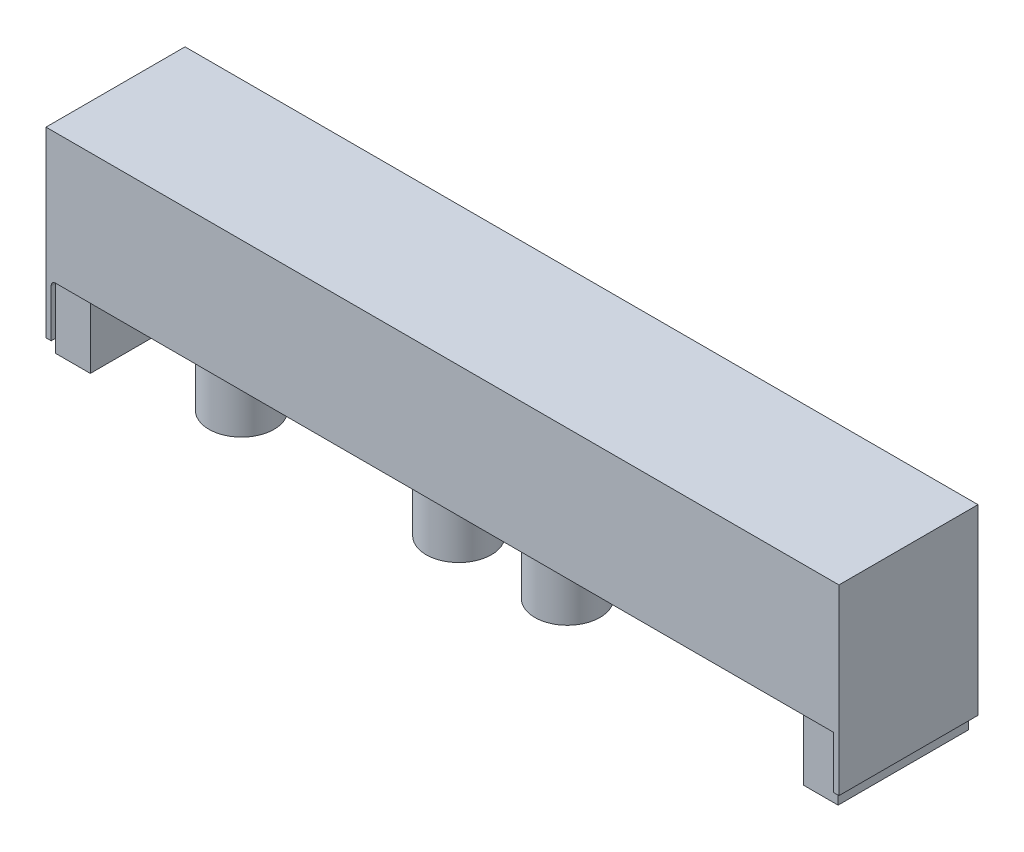
ISO-10303-21;
HEADER;
FILE_DESCRIPTION(('STEP AP214'),'2;1');
FILE_NAME('part.step','',(''),(''),'','','');
FILE_SCHEMA(('AUTOMOTIVE_DESIGN { 1 0 10303 214 1 1 1 1 }'));
ENDSEC;
DATA;
#1=APPLICATION_CONTEXT('core data for automotive mechanical design processes');
#2=APPLICATION_PROTOCOL_DEFINITION('international standard','automotive_design',2000,#1);
#3=PRODUCT_CONTEXT('',#1,'mechanical');
#4=PRODUCT('Part','Part','',(#3));
#5=PRODUCT_RELATED_PRODUCT_CATEGORY('part','',(#4));
#6=PRODUCT_DEFINITION_FORMATION('','',#4);
#7=PRODUCT_DEFINITION_CONTEXT('part definition',#1,'design');
#8=PRODUCT_DEFINITION('design','',#6,#7);
#9=PRODUCT_DEFINITION_SHAPE('','',#8);
#10=(LENGTH_UNIT() NAMED_UNIT(*) SI_UNIT(.MILLI.,.METRE.));
#11=(NAMED_UNIT(*) PLANE_ANGLE_UNIT() SI_UNIT($,.RADIAN.));
#12=(NAMED_UNIT(*) SI_UNIT($,.STERADIAN.) SOLID_ANGLE_UNIT());
#13=UNCERTAINTY_MEASURE_WITH_UNIT(LENGTH_MEASURE(1.E-05),#10,'distance_accuracy_value','');
#14=(GEOMETRIC_REPRESENTATION_CONTEXT(3) GLOBAL_UNCERTAINTY_ASSIGNED_CONTEXT((#13)) GLOBAL_UNIT_ASSIGNED_CONTEXT((#10,
#11,#12)) REPRESENTATION_CONTEXT('',''));
#15=CARTESIAN_POINT('',(0.,0.,0.));
#16=DIRECTION('',(0.,0.,1.));
#17=DIRECTION('',(1.,0.,0.));
#18=AXIS2_PLACEMENT_3D('',#15,#16,#17);
#19=CARTESIAN_POINT('',(86.05,1.4999999993961,11.));
#20=DIRECTION('',(0.,-1.,0.));
#21=DIRECTION('',(0.,0.,-1.));
#22=AXIS2_PLACEMENT_3D('',#19,#20,#21);
#23=CONICAL_SURFACE('',#22,1.22949999951077,1.02974425744243);
#24=CARTESIAN_POINT('',(86.0499999998865,2.23875813219365,11.));
#25=VERTEX_POINT('',#24);
#26=VERTEX_LOOP('',#25);
#27=FACE_BOUND('',#26,.T.);
#28=CARTESIAN_POINT('',(86.05,1.5,11.));
#29=DIRECTION('',(0.,-1.,0.));
#30=DIRECTION('',(0.,0.,-1.));
#31=AXIS2_PLACEMENT_3D('',#28,#29,#30);
#32=CIRCLE('',#31,1.2295);
#33=CARTESIAN_POINT('',(86.05,1.5,9.7705));
#34=VERTEX_POINT('',#33);
#35=EDGE_CURVE('E389',#34,#34,#32,.T.);
#36=ORIENTED_EDGE('',*,*,#35,.T.);
#37=EDGE_LOOP('',(#36));
#38=FACE_BOUND('',#37,.T.);
#39=ADVANCED_FACE('F17',(#27,#38),#23,.F.);
#40=CARTESIAN_POINT('',(86.05,1.4999999993961,-11.));
#41=DIRECTION('',(0.,-1.,0.));
#42=DIRECTION('',(0.,0.,-1.));
#43=AXIS2_PLACEMENT_3D('',#40,#41,#42);
#44=CONICAL_SURFACE('',#43,1.22949999951077,1.02974425744243);
#45=CARTESIAN_POINT('',(86.0499999998865,2.23875813219365,-11.));
#46=VERTEX_POINT('',#45);
#47=VERTEX_LOOP('',#46);
#48=FACE_BOUND('',#47,.T.);
#49=CARTESIAN_POINT('',(86.05,1.5,-11.));
#50=DIRECTION('',(0.,-1.,0.));
#51=DIRECTION('',(0.,0.,-1.));
#52=AXIS2_PLACEMENT_3D('',#49,#50,#51);
#53=CIRCLE('',#52,1.2295);
#54=CARTESIAN_POINT('',(86.05,1.5,-12.2295));
#55=VERTEX_POINT('',#54);
#56=EDGE_CURVE('E384',#55,#55,#53,.T.);
#57=ORIENTED_EDGE('',*,*,#56,.T.);
#58=EDGE_LOOP('',(#57));
#59=FACE_BOUND('',#58,.T.);
#60=ADVANCED_FACE('F870',(#48,#59),#44,.F.);
#61=CARTESIAN_POINT('',(-86.05,1.4999999993961,-11.));
#62=DIRECTION('',(0.,-1.,0.));
#63=DIRECTION('',(0.,0.,-1.));
#64=AXIS2_PLACEMENT_3D('',#61,#62,#63);
#65=CONICAL_SURFACE('',#64,1.22949999951044,1.02974425744219);
#66=CARTESIAN_POINT('',(-86.0500000000002,2.23875813213681,-11.));
#67=VERTEX_POINT('',#66);
#68=VERTEX_LOOP('',#67);
#69=FACE_BOUND('',#68,.T.);
#70=CARTESIAN_POINT('',(-86.05,1.5,-11.));
#71=DIRECTION('',(0.,-1.,0.));
#72=DIRECTION('',(0.,0.,-1.));
#73=AXIS2_PLACEMENT_3D('',#70,#71,#72);
#74=CIRCLE('',#73,1.2295);
#75=CARTESIAN_POINT('',(-86.05,1.5,-12.2295));
#76=VERTEX_POINT('',#75);
#77=EDGE_CURVE('E379',#76,#76,#74,.T.);
#78=ORIENTED_EDGE('',*,*,#77,.T.);
#79=EDGE_LOOP('',(#78));
#80=FACE_BOUND('',#79,.T.);
#81=ADVANCED_FACE('F861',(#69,#80),#65,.F.);
#82=CARTESIAN_POINT('',(-86.05,1.4999999993961,11.));
#83=DIRECTION('',(0.,-1.,0.));
#84=DIRECTION('',(0.,0.,-1.));
#85=AXIS2_PLACEMENT_3D('',#82,#83,#84);
#86=CONICAL_SURFACE('',#85,1.22949999951044,1.02974425744219);
#87=CARTESIAN_POINT('',(-86.0500000000002,2.23875813213681,11.));
#88=VERTEX_POINT('',#87);
#89=VERTEX_LOOP('',#88);
#90=FACE_BOUND('',#89,.T.);
#91=CARTESIAN_POINT('',(-86.05,1.5,11.));
#92=DIRECTION('',(0.,-1.,0.));
#93=DIRECTION('',(0.,0.,-1.));
#94=AXIS2_PLACEMENT_3D('',#91,#92,#93);
#95=CIRCLE('',#94,1.2295);
#96=CARTESIAN_POINT('',(-86.05,1.5,9.7705));
#97=VERTEX_POINT('',#96);
#98=EDGE_CURVE('E376',#97,#97,#95,.T.);
#99=ORIENTED_EDGE('',*,*,#98,.T.);
#100=EDGE_LOOP('',(#99));
#101=FACE_BOUND('',#100,.T.);
#102=ADVANCED_FACE('F852',(#90,#101),#86,.F.);
#103=CARTESIAN_POINT('',(86.05,-4.5,11.));
#104=DIRECTION('',(0.,-1.,0.));
#105=DIRECTION('',(0.,0.,-1.));
#106=AXIS2_PLACEMENT_3D('',#103,#104,#105);
#107=CYLINDRICAL_SURFACE('',#106,1.2295);
#108=ORIENTED_EDGE('',*,*,#35,.F.);
#109=EDGE_LOOP('',(#108));
#110=FACE_BOUND('',#109,.T.);
#111=CARTESIAN_POINT('',(86.05,-3.00000000000001,11.));
#112=DIRECTION('',(0.,-1.,0.));
#113=DIRECTION('',(0.,0.,-1.));
#114=AXIS2_PLACEMENT_3D('',#111,#112,#113);
#115=CIRCLE('',#114,1.2295);
#116=CARTESIAN_POINT('',(86.05,-3.00000000000001,9.7705));
#117=VERTEX_POINT('',#116);
#118=EDGE_CURVE('E20',#117,#117,#115,.T.);
#119=ORIENTED_EDGE('',*,*,#118,.T.);
#120=EDGE_LOOP('',(#119));
#121=FACE_BOUND('',#120,.T.);
#122=ADVANCED_FACE('F428',(#110,#121),#107,.F.);
#123=CARTESIAN_POINT('',(86.05,-4.5,-11.));
#124=DIRECTION('',(0.,-1.,0.));
#125=DIRECTION('',(0.,0.,-1.));
#126=AXIS2_PLACEMENT_3D('',#123,#124,#125);
#127=CYLINDRICAL_SURFACE('',#126,1.2295);
#128=ORIENTED_EDGE('',*,*,#56,.F.);
#129=EDGE_LOOP('',(#128));
#130=FACE_BOUND('',#129,.T.);
#131=CARTESIAN_POINT('',(86.05,-3.00000000000001,-11.));
#132=DIRECTION('',(0.,-1.,0.));
#133=DIRECTION('',(0.,0.,-1.));
#134=AXIS2_PLACEMENT_3D('',#131,#132,#133);
#135=CIRCLE('',#134,1.2295);
#136=CARTESIAN_POINT('',(86.05,-3.00000000000001,-12.2295));
#137=VERTEX_POINT('',#136);
#138=EDGE_CURVE('E421',#137,#137,#135,.T.);
#139=ORIENTED_EDGE('',*,*,#138,.T.);
#140=EDGE_LOOP('',(#139));
#141=FACE_BOUND('',#140,.T.);
#142=ADVANCED_FACE('F835',(#130,#141),#127,.F.);
#143=CARTESIAN_POINT('',(-86.05,-4.5,-11.));
#144=DIRECTION('',(0.,-1.,0.));
#145=DIRECTION('',(0.,0.,-1.));
#146=AXIS2_PLACEMENT_3D('',#143,#144,#145);
#147=CYLINDRICAL_SURFACE('',#146,1.2295);
#148=ORIENTED_EDGE('',*,*,#77,.F.);
#149=EDGE_LOOP('',(#148));
#150=FACE_BOUND('',#149,.T.);
#151=CARTESIAN_POINT('',(-86.05,-3.00000000000001,-11.));
#152=DIRECTION('',(0.,-1.,0.));
#153=DIRECTION('',(0.,0.,-1.));
#154=AXIS2_PLACEMENT_3D('',#151,#152,#153);
#155=CIRCLE('',#154,1.2295);
#156=CARTESIAN_POINT('',(-86.05,-3.00000000000001,-12.2295));
#157=VERTEX_POINT('',#156);
#158=EDGE_CURVE('E419',#157,#157,#155,.T.);
#159=ORIENTED_EDGE('',*,*,#158,.T.);
#160=EDGE_LOOP('',(#159));
#161=FACE_BOUND('',#160,.T.);
#162=ADVANCED_FACE('F826',(#150,#161),#147,.F.);
#163=CARTESIAN_POINT('',(-86.05,-4.5,11.));
#164=DIRECTION('',(0.,-1.,0.));
#165=DIRECTION('',(0.,0.,-1.));
#166=AXIS2_PLACEMENT_3D('',#163,#164,#165);
#167=CYLINDRICAL_SURFACE('',#166,1.2295);
#168=ORIENTED_EDGE('',*,*,#98,.F.);
#169=EDGE_LOOP('',(#168));
#170=FACE_BOUND('',#169,.T.);
#171=CARTESIAN_POINT('',(-86.05,-3.00000000000001,11.));
#172=DIRECTION('',(0.,-1.,0.));
#173=DIRECTION('',(0.,0.,-1.));
#174=AXIS2_PLACEMENT_3D('',#171,#172,#173);
#175=CIRCLE('',#174,1.2295);
#176=CARTESIAN_POINT('',(-86.05,-3.00000000000001,9.7705));
#177=VERTEX_POINT('',#176);
#178=EDGE_CURVE('E366',#177,#177,#175,.T.);
#179=ORIENTED_EDGE('',*,*,#178,.T.);
#180=EDGE_LOOP('',(#179));
#181=FACE_BOUND('',#180,.T.);
#182=ADVANCED_FACE('F817',(#170,#181),#167,.F.);
#183=CARTESIAN_POINT('',(-91.25,-8.00000000000001,16.));
#184=DIRECTION('',(0.,1.,0.));
#185=DIRECTION('',(0.,0.,1.));
#186=AXIS2_PLACEMENT_3D('',#183,#184,#185);
#187=PLANE('',#186);
#188=CARTESIAN_POINT('',(12.75,-8.00000000000001,0.));
#189=DIRECTION('',(0.,-1.,0.));
#190=DIRECTION('',(0.,0.,-1.));
#191=AXIS2_PLACEMENT_3D('',#188,#189,#190);
#192=CIRCLE('',#191,7.5);
#193=CARTESIAN_POINT('',(12.75,-8.00000000000001,-7.5));
#194=VERTEX_POINT('',#193);
#195=EDGE_CURVE('E329',#194,#194,#192,.F.);
#196=ORIENTED_EDGE('',*,*,#195,.F.);
#197=EDGE_LOOP('',(#196));
#198=FACE_BOUND('',#197,.T.);
#199=ADVANCED_FACE('F808',(#198),#187,.F.);
#200=CARTESIAN_POINT('',(-91.25,-8.00000000000001,16.));
#201=DIRECTION('',(0.,1.,0.));
#202=DIRECTION('',(0.,0.,1.));
#203=AXIS2_PLACEMENT_3D('',#200,#201,#202);
#204=PLANE('',#203);
#205=CARTESIAN_POINT('',(-12.25,-8.00000000000001,0.));
#206=DIRECTION('',(0.,-1.,0.));
#207=DIRECTION('',(1.,0.,0.));
#208=AXIS2_PLACEMENT_3D('',#205,#206,#207);
#209=CIRCLE('',#208,7.5);
#210=CARTESIAN_POINT('',(-4.75000000000001,-8.00000000000001,0.));
#211=VERTEX_POINT('',#210);
#212=EDGE_CURVE('E412',#211,#211,#209,.F.);
#213=ORIENTED_EDGE('',*,*,#212,.F.);
#214=EDGE_LOOP('',(#213));
#215=FACE_BOUND('',#214,.T.);
#216=ADVANCED_FACE('F799',(#215),#204,.F.);
#217=CARTESIAN_POINT('',(-91.25,-8.00000000000001,16.));
#218=DIRECTION('',(0.,1.,0.));
#219=DIRECTION('',(0.,0.,1.));
#220=AXIS2_PLACEMENT_3D('',#217,#218,#219);
#221=PLANE('',#220);
#222=CARTESIAN_POINT('',(-62.25,-8.00000000000001,0.));
#223=DIRECTION('',(0.,-1.,0.));
#224=DIRECTION('',(0.,0.,-1.));
#225=AXIS2_PLACEMENT_3D('',#222,#223,#224);
#226=CIRCLE('',#225,7.5);
#227=CARTESIAN_POINT('',(-62.25,-8.00000000000001,-7.5));
#228=VERTEX_POINT('',#227);
#229=EDGE_CURVE('E274',#228,#228,#226,.F.);
#230=ORIENTED_EDGE('',*,*,#229,.F.);
#231=EDGE_LOOP('',(#230));
#232=FACE_BOUND('',#231,.T.);
#233=ADVANCED_FACE('F434',(#232),#221,.F.);
#234=CARTESIAN_POINT('',(-91.25,-3.00000000000001,16.));
#235=DIRECTION('',(0.,1.,0.));
#236=DIRECTION('',(0.,0.,1.));
#237=AXIS2_PLACEMENT_3D('',#234,#235,#236);
#238=PLANE('',#237);
#239=ORIENTED_EDGE('',*,*,#138,.F.);
#240=EDGE_LOOP('',(#239));
#241=FACE_BOUND('',#240,.T.);
#242=ORIENTED_EDGE('',*,*,#118,.F.);
#243=EDGE_LOOP('',(#242));
#244=FACE_BOUND('',#243,.T.);
#245=DIRECTION('',(0.,0.,1.));
#246=VECTOR('',#245,1.);
#247=CARTESIAN_POINT('',(82.05,-2.99999999999999,15.));
#248=LINE('',#247,#246);
#249=CARTESIAN_POINT('',(82.05,-2.99999999999999,-15.));
#250=VERTEX_POINT('',#249);
#251=CARTESIAN_POINT('',(82.05,-2.99999999999999,15.));
#252=VERTEX_POINT('',#251);
#253=EDGE_CURVE('E330',#250,#252,#248,.T.);
#254=ORIENTED_EDGE('',*,*,#253,.F.);
#255=DIRECTION('',(-1.,0.,0.));
#256=VECTOR('',#255,1.);
#257=CARTESIAN_POINT('',(82.05,-2.99999999999999,-15.));
#258=LINE('',#257,#256);
#259=CARTESIAN_POINT('',(90.05,-2.99999999999999,-15.));
#260=VERTEX_POINT('',#259);
#261=EDGE_CURVE('E273',#260,#250,#258,.T.);
#262=ORIENTED_EDGE('',*,*,#261,.F.);
#263=DIRECTION('',(0.,0.,-1.));
#264=VECTOR('',#263,1.);
#265=CARTESIAN_POINT('',(90.05,-2.99999999999999,-15.));
#266=LINE('',#265,#264);
#267=CARTESIAN_POINT('',(90.05,-2.99999999999999,15.));
#268=VERTEX_POINT('',#267);
#269=EDGE_CURVE('E364',#268,#260,#266,.T.);
#270=ORIENTED_EDGE('',*,*,#269,.F.);
#271=DIRECTION('',(1.,0.,0.));
#272=VECTOR('',#271,1.);
#273=CARTESIAN_POINT('',(90.05,-2.99999999999999,15.));
#274=LINE('',#273,#272);
#275=EDGE_CURVE('E343',#252,#268,#274,.T.);
#276=ORIENTED_EDGE('',*,*,#275,.F.);
#277=EDGE_LOOP('',(#254,#262,#270,#276));
#278=FACE_BOUND('',#277,.T.);
#279=ADVANCED_FACE('F430',(#241,#244,#278),#238,.F.);
#280=CARTESIAN_POINT('',(-91.25,-3.00000000000001,16.));
#281=DIRECTION('',(0.,1.,0.));
#282=DIRECTION('',(0.,0.,1.));
#283=AXIS2_PLACEMENT_3D('',#280,#281,#282);
#284=PLANE('',#283);
#285=ORIENTED_EDGE('',*,*,#178,.F.);
#286=EDGE_LOOP('',(#285));
#287=FACE_BOUND('',#286,.T.);
#288=ORIENTED_EDGE('',*,*,#158,.F.);
#289=EDGE_LOOP('',(#288));
#290=FACE_BOUND('',#289,.T.);
#291=DIRECTION('',(0.,0.,-1.));
#292=VECTOR('',#291,1.);
#293=CARTESIAN_POINT('',(-82.05,-3.00000000000001,-15.));
#294=LINE('',#293,#292);
#295=CARTESIAN_POINT('',(-82.05,-3.00000000000001,15.));
#296=VERTEX_POINT('',#295);
#297=CARTESIAN_POINT('',(-82.05,-3.00000000000001,-15.));
#298=VERTEX_POINT('',#297);
#299=EDGE_CURVE('E305',#296,#298,#294,.T.);
#300=ORIENTED_EDGE('',*,*,#299,.F.);
#301=DIRECTION('',(1.,0.,0.));
#302=VECTOR('',#301,1.);
#303=CARTESIAN_POINT('',(-82.05,-3.00000000000001,15.));
#304=LINE('',#303,#302);
#305=CARTESIAN_POINT('',(-90.05,-3.00000000000001,15.));
#306=VERTEX_POINT('',#305);
#307=EDGE_CURVE('E312',#306,#296,#304,.T.);
#308=ORIENTED_EDGE('',*,*,#307,.F.);
#309=DIRECTION('',(0.,0.,1.));
#310=VECTOR('',#309,1.);
#311=CARTESIAN_POINT('',(-90.05,-3.00000000000001,15.));
#312=LINE('',#311,#310);
#313=CARTESIAN_POINT('',(-90.05,-3.00000000000001,-15.));
#314=VERTEX_POINT('',#313);
#315=EDGE_CURVE('E242',#314,#306,#312,.T.);
#316=ORIENTED_EDGE('',*,*,#315,.F.);
#317=DIRECTION('',(-1.,0.,0.));
#318=VECTOR('',#317,1.);
#319=CARTESIAN_POINT('',(-90.05,-3.00000000000001,-15.));
#320=LINE('',#319,#318);
#321=EDGE_CURVE('E304',#298,#314,#320,.T.);
#322=ORIENTED_EDGE('',*,*,#321,.F.);
#323=EDGE_LOOP('',(#300,#308,#316,#322));
#324=FACE_BOUND('',#323,.T.);
#325=ADVANCED_FACE('F433',(#287,#290,#324),#284,.F.);
#326=CARTESIAN_POINT('',(90.05,-7.99999999999999,-15.));
#327=DIRECTION('',(1.,0.,0.));
#328=DIRECTION('',(0.,0.,-1.));
#329=AXIS2_PLACEMENT_3D('',#326,#327,#328);
#330=PLANE('',#329);
#331=ORIENTED_EDGE('',*,*,#269,.T.);
#332=DIRECTION('',(0.,1.,0.));
#333=VECTOR('',#332,1.);
#334=CARTESIAN_POINT('',(90.05,-7.99999999999999,-15.));
#335=LINE('',#334,#333);
#336=CARTESIAN_POINT('',(90.05,0.,-15.));
#337=VERTEX_POINT('',#336);
#338=EDGE_CURVE('E270',#337,#260,#335,.F.);
#339=ORIENTED_EDGE('',*,*,#338,.F.);
#340=DIRECTION('',(0.,0.,-1.));
#341=VECTOR('',#340,1.);
#342=CARTESIAN_POINT('',(90.05,0.,0.));
#343=LINE('',#342,#341);
#344=CARTESIAN_POINT('',(90.05,0.,15.));
#345=VERTEX_POINT('',#344);
#346=EDGE_CURVE('E277',#345,#337,#343,.T.);
#347=ORIENTED_EDGE('',*,*,#346,.F.);
#348=DIRECTION('',(0.,1.,0.));
#349=VECTOR('',#348,1.);
#350=CARTESIAN_POINT('',(90.05,-7.99999999999999,15.));
#351=LINE('',#350,#349);
#352=EDGE_CURVE('E341',#268,#345,#351,.T.);
#353=ORIENTED_EDGE('',*,*,#352,.F.);
#354=EDGE_LOOP('',(#331,#339,#347,#353));
#355=FACE_BOUND('',#354,.T.);
#356=ADVANCED_FACE('F448',(#355),#330,.T.);
#357=CARTESIAN_POINT('',(90.05,-7.99999999999999,15.));
#358=DIRECTION('',(0.,0.,1.));
#359=DIRECTION('',(1.,0.,0.));
#360=AXIS2_PLACEMENT_3D('',#357,#358,#359);
#361=PLANE('',#360);
#362=ORIENTED_EDGE('',*,*,#352,.T.);
#363=DIRECTION('',(0.,1.,0.));
#364=VECTOR('',#363,1.);
#365=CARTESIAN_POINT('',(90.05,0.,15.));
#366=LINE('',#365,#364);
#367=CARTESIAN_POINT('',(90.05,12.,15.));
#368=VERTEX_POINT('',#367);
#369=EDGE_CURVE('E172',#368,#345,#366,.F.);
#370=ORIENTED_EDGE('',*,*,#369,.F.);
#371=DIRECTION('',(1.,0.,0.));
#372=VECTOR('',#371,1.);
#373=CARTESIAN_POINT('',(90.05,12.,15.));
#374=LINE('',#373,#372);
#375=CARTESIAN_POINT('',(82.05,12.,15.));
#376=VERTEX_POINT('',#375);
#377=EDGE_CURVE('E191',#376,#368,#374,.T.);
#378=ORIENTED_EDGE('',*,*,#377,.F.);
#379=DIRECTION('',(0.,1.,0.));
#380=VECTOR('',#379,1.);
#381=CARTESIAN_POINT('',(82.05,-7.99999999999999,15.));
#382=LINE('',#381,#380);
#383=EDGE_CURVE('E326',#252,#376,#382,.T.);
#384=ORIENTED_EDGE('',*,*,#383,.F.);
#385=ORIENTED_EDGE('',*,*,#275,.T.);
#386=EDGE_LOOP('',(#362,#370,#378,#384,#385));
#387=FACE_BOUND('',#386,.T.);
#388=ADVANCED_FACE('F451',(#387),#361,.T.);
#389=CARTESIAN_POINT('',(-82.05,-8.00000000000001,15.));
#390=DIRECTION('',(0.,0.,1.));
#391=DIRECTION('',(1.,0.,0.));
#392=AXIS2_PLACEMENT_3D('',#389,#390,#391);
#393=PLANE('',#392);
#394=DIRECTION('',(0.,1.,0.));
#395=VECTOR('',#394,1.);
#396=CARTESIAN_POINT('',(-82.05,-8.00000000000001,15.));
#397=LINE('',#396,#395);
#398=CARTESIAN_POINT('',(-82.05,12.,15.));
#399=VERTEX_POINT('',#398);
#400=EDGE_CURVE('E178',#399,#296,#397,.F.);
#401=ORIENTED_EDGE('',*,*,#400,.F.);
#402=DIRECTION('',(1.,0.,0.));
#403=VECTOR('',#402,1.);
#404=CARTESIAN_POINT('',(90.05,12.,15.));
#405=LINE('',#404,#403);
#406=CARTESIAN_POINT('',(-89.05,12.,15.));
#407=VERTEX_POINT('',#406);
#408=EDGE_CURVE('E175',#407,#399,#405,.T.);
#409=ORIENTED_EDGE('',*,*,#408,.F.);
#410=CARTESIAN_POINT('',(-89.05,11.,15.));
#411=DIRECTION('',(0.,0.,1.));
#412=DIRECTION('',(1.,0.,0.));
#413=AXIS2_PLACEMENT_3D('',#410,#411,#412);
#414=CIRCLE('',#413,0.999999999999996);
#415=CARTESIAN_POINT('',(-90.05,11.,15.));
#416=VERTEX_POINT('',#415);
#417=EDGE_CURVE('E163',#407,#416,#414,.T.);
#418=ORIENTED_EDGE('',*,*,#417,.T.);
#419=DIRECTION('',(0.,1.,0.));
#420=VECTOR('',#419,1.);
#421=CARTESIAN_POINT('',(-90.05,11.,15.));
#422=LINE('',#421,#420);
#423=CARTESIAN_POINT('',(-90.05,0.,15.));
#424=VERTEX_POINT('',#423);
#425=EDGE_CURVE('E206',#424,#416,#422,.T.);
#426=ORIENTED_EDGE('',*,*,#425,.F.);
#427=DIRECTION('',(0.,1.,0.));
#428=VECTOR('',#427,1.);
#429=CARTESIAN_POINT('',(-90.05,-8.00000000000001,15.));
#430=LINE('',#429,#428);
#431=EDGE_CURVE('E232',#306,#424,#430,.T.);
#432=ORIENTED_EDGE('',*,*,#431,.F.);
#433=ORIENTED_EDGE('',*,*,#307,.T.);
#434=EDGE_LOOP('',(#401,#409,#418,#426,#432,#433));
#435=FACE_BOUND('',#434,.T.);
#436=ADVANCED_FACE('F176',(#435),#393,.T.);
#437=CARTESIAN_POINT('',(-82.05,-8.00000000000001,-15.));
#438=DIRECTION('',(1.,0.,0.));
#439=DIRECTION('',(0.,0.,-1.));
#440=AXIS2_PLACEMENT_3D('',#437,#438,#439);
#441=PLANE('',#440);
#442=ORIENTED_EDGE('',*,*,#299,.T.);
#443=DIRECTION('',(0.,1.,0.));
#444=VECTOR('',#443,1.);
#445=CARTESIAN_POINT('',(-82.05,-8.00000000000001,-15.));
#446=LINE('',#445,#444);
#447=CARTESIAN_POINT('',(-82.05,12.,-15.));
#448=VERTEX_POINT('',#447);
#449=EDGE_CURVE('E301',#448,#298,#446,.F.);
#450=ORIENTED_EDGE('',*,*,#449,.F.);
#451=DIRECTION('',(0.,0.,-1.));
#452=VECTOR('',#451,1.);
#453=CARTESIAN_POINT('',(-82.05,12.,0.));
#454=LINE('',#453,#452);
#455=EDGE_CURVE('E182',#399,#448,#454,.T.);
#456=ORIENTED_EDGE('',*,*,#455,.F.);
#457=ORIENTED_EDGE('',*,*,#400,.T.);
#458=EDGE_LOOP('',(#442,#450,#456,#457));
#459=FACE_BOUND('',#458,.T.);
#460=ADVANCED_FACE('F552',(#459),#441,.T.);
#461=CARTESIAN_POINT('',(-90.05,-8.00000000000001,-15.));
#462=DIRECTION('',(0.,0.,-1.));
#463=DIRECTION('',(-1.,0.,0.));
#464=AXIS2_PLACEMENT_3D('',#461,#462,#463);
#465=PLANE('',#464);
#466=DIRECTION('',(0.,1.,0.));
#467=VECTOR('',#466,1.);
#468=CARTESIAN_POINT('',(-90.05,-8.00000000000001,-15.));
#469=LINE('',#468,#467);
#470=CARTESIAN_POINT('',(-90.05,0.,-15.));
#471=VERTEX_POINT('',#470);
#472=EDGE_CURVE('E245',#471,#314,#469,.F.);
#473=ORIENTED_EDGE('',*,*,#472,.F.);
#474=DIRECTION('',(0.,1.,0.));
#475=VECTOR('',#474,1.);
#476=CARTESIAN_POINT('',(-90.05,11.,-15.));
#477=LINE('',#476,#475);
#478=CARTESIAN_POINT('',(-90.05,11.,-15.));
#479=VERTEX_POINT('',#478);
#480=EDGE_CURVE('E251',#479,#471,#477,.F.);
#481=ORIENTED_EDGE('',*,*,#480,.F.);
#482=CARTESIAN_POINT('',(-89.05,11.,-15.));
#483=DIRECTION('',(0.,0.,1.));
#484=DIRECTION('',(1.,0.,0.));
#485=AXIS2_PLACEMENT_3D('',#482,#483,#484);
#486=CIRCLE('',#485,0.999999999999996);
#487=CARTESIAN_POINT('',(-89.05,12.,-15.));
#488=VERTEX_POINT('',#487);
#489=EDGE_CURVE('E323',#479,#488,#486,.F.);
#490=ORIENTED_EDGE('',*,*,#489,.T.);
#491=DIRECTION('',(1.,0.,0.));
#492=VECTOR('',#491,1.);
#493=CARTESIAN_POINT('',(90.05,12.,-15.));
#494=LINE('',#493,#492);
#495=EDGE_CURVE('E296',#448,#488,#494,.F.);
#496=ORIENTED_EDGE('',*,*,#495,.F.);
#497=ORIENTED_EDGE('',*,*,#449,.T.);
#498=ORIENTED_EDGE('',*,*,#321,.T.);
#499=EDGE_LOOP('',(#473,#481,#490,#496,#497,#498));
#500=FACE_BOUND('',#499,.T.);
#501=ADVANCED_FACE('F549',(#500),#465,.T.);
#502=CARTESIAN_POINT('',(82.05,-7.99999999999999,15.));
#503=DIRECTION('',(-1.,0.,0.));
#504=DIRECTION('',(0.,0.,1.));
#505=AXIS2_PLACEMENT_3D('',#502,#503,#504);
#506=PLANE('',#505);
#507=ORIENTED_EDGE('',*,*,#253,.T.);
#508=ORIENTED_EDGE('',*,*,#383,.T.);
#509=DIRECTION('',(0.,0.,-1.));
#510=VECTOR('',#509,1.);
#511=CARTESIAN_POINT('',(82.05,12.,0.));
#512=LINE('',#511,#510);
#513=CARTESIAN_POINT('',(82.05,12.,-15.));
#514=VERTEX_POINT('',#513);
#515=EDGE_CURVE('E259',#514,#376,#512,.F.);
#516=ORIENTED_EDGE('',*,*,#515,.F.);
#517=DIRECTION('',(0.,1.,0.));
#518=VECTOR('',#517,1.);
#519=CARTESIAN_POINT('',(82.05,-7.99999999999999,-15.));
#520=LINE('',#519,#518);
#521=EDGE_CURVE('E248',#250,#514,#520,.T.);
#522=ORIENTED_EDGE('',*,*,#521,.F.);
#523=EDGE_LOOP('',(#507,#508,#516,#522));
#524=FACE_BOUND('',#523,.T.);
#525=ADVANCED_FACE('F442',(#524),#506,.T.);
#526=CARTESIAN_POINT('',(12.75,12.,0.));
#527=DIRECTION('',(0.,-1.,0.));
#528=DIRECTION('',(0.,0.,-1.));
#529=AXIS2_PLACEMENT_3D('',#526,#527,#528);
#530=CYLINDRICAL_SURFACE('',#529,7.5);
#531=ORIENTED_EDGE('',*,*,#195,.T.);
#532=EDGE_LOOP('',(#531));
#533=FACE_BOUND('',#532,.T.);
#534=CARTESIAN_POINT('',(12.75,12.,0.));
#535=DIRECTION('',(0.,-1.,0.));
#536=DIRECTION('',(0.,0.,-1.));
#537=AXIS2_PLACEMENT_3D('',#534,#535,#536);
#538=CIRCLE('',#537,7.5);
#539=CARTESIAN_POINT('',(12.75,12.,-7.5));
#540=VERTEX_POINT('',#539);
#541=EDGE_CURVE('E293',#540,#540,#538,.F.);
#542=ORIENTED_EDGE('',*,*,#541,.F.);
#543=EDGE_LOOP('',(#542));
#544=FACE_BOUND('',#543,.T.);
#545=ADVANCED_FACE('F608',(#533,#544),#530,.T.);
#546=CARTESIAN_POINT('',(-12.25,12.,0.));
#547=DIRECTION('',(0.,-1.,0.));
#548=DIRECTION('',(1.,0.,0.));
#549=AXIS2_PLACEMENT_3D('',#546,#547,#548);
#550=CYLINDRICAL_SURFACE('',#549,7.5);
#551=ORIENTED_EDGE('',*,*,#212,.T.);
#552=EDGE_LOOP('',(#551));
#553=FACE_BOUND('',#552,.T.);
#554=CARTESIAN_POINT('',(-12.25,12.,0.));
#555=DIRECTION('',(0.,-1.,0.));
#556=DIRECTION('',(1.,0.,0.));
#557=AXIS2_PLACEMENT_3D('',#554,#555,#556);
#558=CIRCLE('',#557,7.5);
#559=CARTESIAN_POINT('',(-4.75000000000001,12.,0.));
#560=VERTEX_POINT('',#559);
#561=EDGE_CURVE('E404',#560,#560,#558,.F.);
#562=ORIENTED_EDGE('',*,*,#561,.F.);
#563=EDGE_LOOP('',(#562));
#564=FACE_BOUND('',#563,.T.);
#565=ADVANCED_FACE('F604',(#553,#564),#550,.T.);
#566=CARTESIAN_POINT('',(-62.25,12.,0.));
#567=DIRECTION('',(0.,-1.,0.));
#568=DIRECTION('',(0.,0.,-1.));
#569=AXIS2_PLACEMENT_3D('',#566,#567,#568);
#570=CYLINDRICAL_SURFACE('',#569,7.5);
#571=ORIENTED_EDGE('',*,*,#229,.T.);
#572=EDGE_LOOP('',(#571));
#573=FACE_BOUND('',#572,.T.);
#574=CARTESIAN_POINT('',(-62.25,12.,0.));
#575=DIRECTION('',(0.,-1.,0.));
#576=DIRECTION('',(0.,0.,-1.));
#577=AXIS2_PLACEMENT_3D('',#574,#575,#576);
#578=CIRCLE('',#577,7.5);
#579=CARTESIAN_POINT('',(-62.25,12.,-7.5));
#580=VERTEX_POINT('',#579);
#581=EDGE_CURVE('E267',#580,#580,#578,.F.);
#582=ORIENTED_EDGE('',*,*,#581,.F.);
#583=EDGE_LOOP('',(#582));
#584=FACE_BOUND('',#583,.T.);
#585=ADVANCED_FACE('F601',(#573,#584),#570,.T.);
#586=CARTESIAN_POINT('',(82.05,-7.99999999999999,-15.));
#587=DIRECTION('',(0.,0.,-1.));
#588=DIRECTION('',(-1.,0.,0.));
#589=AXIS2_PLACEMENT_3D('',#586,#587,#588);
#590=PLANE('',#589);
#591=ORIENTED_EDGE('',*,*,#261,.T.);
#592=ORIENTED_EDGE('',*,*,#521,.T.);
#593=DIRECTION('',(1.,0.,0.));
#594=VECTOR('',#593,1.);
#595=CARTESIAN_POINT('',(90.05,12.,-15.));
#596=LINE('',#595,#594);
#597=CARTESIAN_POINT('',(90.05,12.,-15.));
#598=VERTEX_POINT('',#597);
#599=EDGE_CURVE('E257',#598,#514,#596,.F.);
#600=ORIENTED_EDGE('',*,*,#599,.F.);
#601=DIRECTION('',(0.,1.,0.));
#602=VECTOR('',#601,1.);
#603=CARTESIAN_POINT('',(90.05,0.,-15.));
#604=LINE('',#603,#602);
#605=EDGE_CURVE('E263',#337,#598,#604,.T.);
#606=ORIENTED_EDGE('',*,*,#605,.F.);
#607=ORIENTED_EDGE('',*,*,#338,.T.);
#608=EDGE_LOOP('',(#591,#592,#600,#606,#607));
#609=FACE_BOUND('',#608,.T.);
#610=ADVANCED_FACE('F444',(#609),#590,.T.);
#611=CARTESIAN_POINT('',(-90.05,-8.00000000000001,15.));
#612=DIRECTION('',(-1.,0.,0.));
#613=DIRECTION('',(0.,0.,1.));
#614=AXIS2_PLACEMENT_3D('',#611,#612,#613);
#615=PLANE('',#614);
#616=ORIENTED_EDGE('',*,*,#315,.T.);
#617=ORIENTED_EDGE('',*,*,#431,.T.);
#618=DIRECTION('',(0.,0.,-1.));
#619=VECTOR('',#618,1.);
#620=CARTESIAN_POINT('',(-90.05,0.,0.));
#621=LINE('',#620,#619);
#622=EDGE_CURVE('E215',#471,#424,#621,.F.);
#623=ORIENTED_EDGE('',*,*,#622,.F.);
#624=ORIENTED_EDGE('',*,*,#472,.T.);
#625=EDGE_LOOP('',(#616,#617,#623,#624));
#626=FACE_BOUND('',#625,.T.);
#627=ADVANCED_FACE('F510',(#626),#615,.T.);
#628=CARTESIAN_POINT('',(-90.05,11.,0.));
#629=DIRECTION('',(1.,0.,0.));
#630=DIRECTION('',(0.,0.,-1.));
#631=AXIS2_PLACEMENT_3D('',#628,#629,#630);
#632=PLANE('',#631);
#633=DIRECTION('',(0.,1.,0.));
#634=VECTOR('',#633,1.);
#635=CARTESIAN_POINT('',(-90.05,24.8194714347384,16.));
#636=LINE('',#635,#634);
#637=CARTESIAN_POINT('',(-90.05,0.,16.));
#638=VERTEX_POINT('',#637);
#639=CARTESIAN_POINT('',(-90.05,11.,16.));
#640=VERTEX_POINT('',#639);
#641=EDGE_CURVE('E210',#638,#640,#636,.T.);
#642=ORIENTED_EDGE('',*,*,#641,.F.);
#643=DIRECTION('',(0.,0.,-1.));
#644=VECTOR('',#643,1.);
#645=CARTESIAN_POINT('',(-90.05,0.,0.));
#646=LINE('',#645,#644);
#647=EDGE_CURVE('E211',#424,#638,#646,.F.);
#648=ORIENTED_EDGE('',*,*,#647,.F.);
#649=ORIENTED_EDGE('',*,*,#425,.T.);
#650=DIRECTION('',(0.,0.,1.));
#651=VECTOR('',#650,1.);
#652=CARTESIAN_POINT('',(-90.05,11.,0.));
#653=LINE('',#652,#651);
#654=EDGE_CURVE('E170',#416,#640,#653,.T.);
#655=ORIENTED_EDGE('',*,*,#654,.T.);
#656=EDGE_LOOP('',(#642,#648,#649,#655));
#657=FACE_BOUND('',#656,.T.);
#658=ADVANCED_FACE('F516',(#657),#632,.T.);
#659=CARTESIAN_POINT('',(-89.05,11.,0.));
#660=DIRECTION('',(0.,0.,1.));
#661=DIRECTION('',(1.,0.,0.));
#662=AXIS2_PLACEMENT_3D('',#659,#660,#661);
#663=CYLINDRICAL_SURFACE('',#662,0.999999999999996);
#664=DIRECTION('',(0.,0.,-1.));
#665=VECTOR('',#664,1.);
#666=CARTESIAN_POINT('',(-89.05,12.,0.));
#667=LINE('',#666,#665);
#668=CARTESIAN_POINT('',(-89.05,12.,16.));
#669=VERTEX_POINT('',#668);
#670=EDGE_CURVE('E168',#669,#407,#667,.T.);
#671=ORIENTED_EDGE('',*,*,#670,.F.);
#672=CARTESIAN_POINT('',(-89.05,11.,16.));
#673=DIRECTION('',(0.,0.,1.));
#674=DIRECTION('',(1.,0.,0.));
#675=AXIS2_PLACEMENT_3D('',#672,#673,#674);
#676=CIRCLE('',#675,0.999999999999996);
#677=EDGE_CURVE('E400',#640,#669,#676,.F.);
#678=ORIENTED_EDGE('',*,*,#677,.F.);
#679=ORIENTED_EDGE('',*,*,#654,.F.);
#680=ORIENTED_EDGE('',*,*,#417,.F.);
#681=EDGE_LOOP('',(#671,#678,#679,#680));
#682=FACE_BOUND('',#681,.T.);
#683=ADVANCED_FACE('F165',(#682),#663,.F.);
#684=CARTESIAN_POINT('',(90.05,0.,0.));
#685=DIRECTION('',(-1.,0.,0.));
#686=DIRECTION('',(0.,0.,1.));
#687=AXIS2_PLACEMENT_3D('',#684,#685,#686);
#688=PLANE('',#687);
#689=DIRECTION('',(0.,1.,0.));
#690=VECTOR('',#689,1.);
#691=CARTESIAN_POINT('',(90.05,24.8194714347384,16.));
#692=LINE('',#691,#690);
#693=CARTESIAN_POINT('',(90.05,12.,16.));
#694=VERTEX_POINT('',#693);
#695=CARTESIAN_POINT('',(90.05,0.,16.));
#696=VERTEX_POINT('',#695);
#697=EDGE_CURVE('E199',#694,#696,#692,.F.);
#698=ORIENTED_EDGE('',*,*,#697,.F.);
#699=DIRECTION('',(0.,0.,-1.));
#700=VECTOR('',#699,1.);
#701=CARTESIAN_POINT('',(90.05,12.,0.));
#702=LINE('',#701,#700);
#703=EDGE_CURVE('E189',#368,#694,#702,.F.);
#704=ORIENTED_EDGE('',*,*,#703,.F.);
#705=ORIENTED_EDGE('',*,*,#369,.T.);
#706=DIRECTION('',(0.,0.,-1.));
#707=VECTOR('',#706,1.);
#708=CARTESIAN_POINT('',(90.05,0.,0.));
#709=LINE('',#708,#707);
#710=EDGE_CURVE('E280',#696,#345,#709,.T.);
#711=ORIENTED_EDGE('',*,*,#710,.F.);
#712=EDGE_LOOP('',(#698,#704,#705,#711));
#713=FACE_BOUND('',#712,.T.);
#714=ADVANCED_FACE('F470',(#713),#688,.T.);
#715=CARTESIAN_POINT('',(91.25,0.,0.));
#716=DIRECTION('',(0.,-1.,0.));
#717=DIRECTION('',(0.,0.,-1.));
#718=AXIS2_PLACEMENT_3D('',#715,#716,#717);
#719=PLANE('',#718);
#720=DIRECTION('',(1.,0.,0.));
#721=VECTOR('',#720,1.);
#722=CARTESIAN_POINT('',(91.25,0.,-16.));
#723=LINE('',#722,#721);
#724=CARTESIAN_POINT('',(90.05,0.,-16.));
#725=VERTEX_POINT('',#724);
#726=CARTESIAN_POINT('',(91.25,0.,-16.));
#727=VERTEX_POINT('',#726);
#728=EDGE_CURVE('E194',#725,#727,#723,.T.);
#729=ORIENTED_EDGE('',*,*,#728,.T.);
#730=DIRECTION('',(0.,0.,-1.));
#731=VECTOR('',#730,1.);
#732=CARTESIAN_POINT('',(91.25,0.,0.));
#733=LINE('',#732,#731);
#734=CARTESIAN_POINT('',(91.25,0.,16.));
#735=VERTEX_POINT('',#734);
#736=EDGE_CURVE('E531',#735,#727,#733,.T.);
#737=ORIENTED_EDGE('',*,*,#736,.F.);
#738=DIRECTION('',(1.,0.,0.));
#739=VECTOR('',#738,1.);
#740=CARTESIAN_POINT('',(0.08198129607313,0.,16.));
#741=LINE('',#740,#739);
#742=EDGE_CURVE('E202',#696,#735,#741,.T.);
#743=ORIENTED_EDGE('',*,*,#742,.F.);
#744=ORIENTED_EDGE('',*,*,#710,.T.);
#745=ORIENTED_EDGE('',*,*,#346,.T.);
#746=DIRECTION('',(0.,0.,1.));
#747=VECTOR('',#746,1.);
#748=CARTESIAN_POINT('',(90.05,0.,0.));
#749=LINE('',#748,#747);
#750=EDGE_CURVE('E283',#725,#337,#749,.T.);
#751=ORIENTED_EDGE('',*,*,#750,.F.);
#752=EDGE_LOOP('',(#729,#737,#743,#744,#745,#751));
#753=FACE_BOUND('',#752,.T.);
#754=ADVANCED_FACE('F464',(#753),#719,.T.);
#755=CARTESIAN_POINT('',(-90.05,11.,0.));
#756=DIRECTION('',(1.,0.,0.));
#757=DIRECTION('',(0.,0.,-1.));
#758=AXIS2_PLACEMENT_3D('',#755,#756,#757);
#759=PLANE('',#758);
#760=DIRECTION('',(0.,1.,0.));
#761=VECTOR('',#760,1.);
#762=CARTESIAN_POINT('',(-90.05,24.8194714347384,-16.));
#763=LINE('',#762,#761);
#764=CARTESIAN_POINT('',(-90.05,0.,-16.));
#765=VERTEX_POINT('',#764);
#766=CARTESIAN_POINT('',(-90.05,11.,-16.));
#767=VERTEX_POINT('',#766);
#768=EDGE_CURVE('E399',#765,#767,#763,.T.);
#769=ORIENTED_EDGE('',*,*,#768,.T.);
#770=DIRECTION('',(0.,0.,1.));
#771=VECTOR('',#770,1.);
#772=CARTESIAN_POINT('',(-90.05,11.,0.));
#773=LINE('',#772,#771);
#774=EDGE_CURVE('E254',#767,#479,#773,.T.);
#775=ORIENTED_EDGE('',*,*,#774,.T.);
#776=ORIENTED_EDGE('',*,*,#480,.T.);
#777=DIRECTION('',(0.,0.,-1.));
#778=VECTOR('',#777,1.);
#779=CARTESIAN_POINT('',(-90.05,0.,0.));
#780=LINE('',#779,#778);
#781=EDGE_CURVE('E237',#765,#471,#780,.F.);
#782=ORIENTED_EDGE('',*,*,#781,.F.);
#783=EDGE_LOOP('',(#769,#775,#776,#782));
#784=FACE_BOUND('',#783,.T.);
#785=ADVANCED_FACE('F505',(#784),#759,.T.);
#786=CARTESIAN_POINT('',(-89.05,11.,0.));
#787=DIRECTION('',(0.,0.,1.));
#788=DIRECTION('',(1.,0.,0.));
#789=AXIS2_PLACEMENT_3D('',#786,#787,#788);
#790=CYLINDRICAL_SURFACE('',#789,0.999999999999996);
#791=ORIENTED_EDGE('',*,*,#774,.F.);
#792=CARTESIAN_POINT('',(-89.05,11.,-16.));
#793=DIRECTION('',(0.,0.,1.));
#794=DIRECTION('',(1.,0.,0.));
#795=AXIS2_PLACEMENT_3D('',#792,#793,#794);
#796=CIRCLE('',#795,0.999999999999996);
#797=CARTESIAN_POINT('',(-89.05,12.,-16.));
#798=VERTEX_POINT('',#797);
#799=EDGE_CURVE('E396',#767,#798,#796,.F.);
#800=ORIENTED_EDGE('',*,*,#799,.T.);
#801=DIRECTION('',(0.,0.,-1.));
#802=VECTOR('',#801,1.);
#803=CARTESIAN_POINT('',(-89.05,12.,0.));
#804=LINE('',#803,#802);
#805=EDGE_CURVE('E260',#488,#798,#804,.T.);
#806=ORIENTED_EDGE('',*,*,#805,.F.);
#807=ORIENTED_EDGE('',*,*,#489,.F.);
#808=EDGE_LOOP('',(#791,#800,#806,#807));
#809=FACE_BOUND('',#808,.T.);
#810=ADVANCED_FACE('F547',(#809),#790,.F.);
#811=CARTESIAN_POINT('',(90.05,12.,0.));
#812=DIRECTION('',(0.,-1.,0.));
#813=DIRECTION('',(0.,0.,-1.));
#814=AXIS2_PLACEMENT_3D('',#811,#812,#813);
#815=PLANE('',#814);
#816=ORIENTED_EDGE('',*,*,#581,.T.);
#817=EDGE_LOOP('',(#816));
#818=FACE_BOUND('',#817,.T.);
#819=ORIENTED_EDGE('',*,*,#561,.T.);
#820=EDGE_LOOP('',(#819));
#821=FACE_BOUND('',#820,.T.);
#822=ORIENTED_EDGE('',*,*,#541,.T.);
#823=EDGE_LOOP('',(#822));
#824=FACE_BOUND('',#823,.T.);
#825=ORIENTED_EDGE('',*,*,#599,.T.);
#826=ORIENTED_EDGE('',*,*,#515,.T.);
#827=ORIENTED_EDGE('',*,*,#377,.T.);
#828=ORIENTED_EDGE('',*,*,#703,.T.);
#829=DIRECTION('',(1.,0.,0.));
#830=VECTOR('',#829,1.);
#831=CARTESIAN_POINT('',(0.08198129607313,12.,16.));
#832=LINE('',#831,#830);
#833=EDGE_CURVE('E187',#669,#694,#832,.T.);
#834=ORIENTED_EDGE('',*,*,#833,.F.);
#835=ORIENTED_EDGE('',*,*,#670,.T.);
#836=ORIENTED_EDGE('',*,*,#408,.T.);
#837=ORIENTED_EDGE('',*,*,#455,.T.);
#838=ORIENTED_EDGE('',*,*,#495,.T.);
#839=ORIENTED_EDGE('',*,*,#805,.T.);
#840=DIRECTION('',(1.,0.,0.));
#841=VECTOR('',#840,1.);
#842=CARTESIAN_POINT('',(0.08198129607313,12.,-16.));
#843=LINE('',#842,#841);
#844=CARTESIAN_POINT('',(90.05,12.,-16.));
#845=VERTEX_POINT('',#844);
#846=EDGE_CURVE('E398',#798,#845,#843,.T.);
#847=ORIENTED_EDGE('',*,*,#846,.T.);
#848=DIRECTION('',(0.,0.,1.));
#849=VECTOR('',#848,1.);
#850=CARTESIAN_POINT('',(90.05,12.,0.));
#851=LINE('',#850,#849);
#852=EDGE_CURVE('E266',#598,#845,#851,.F.);
#853=ORIENTED_EDGE('',*,*,#852,.F.);
#854=EDGE_LOOP('',(#825,#826,#827,#828,#834,#835,#836,#837,#838,#839,#847,#853));
#855=FACE_BOUND('',#854,.T.);
#856=ADVANCED_FACE('F185',(#818,#821,#824,#855),#815,.T.);
#857=CARTESIAN_POINT('',(90.05,0.,0.));
#858=DIRECTION('',(-1.,0.,0.));
#859=DIRECTION('',(0.,0.,1.));
#860=AXIS2_PLACEMENT_3D('',#857,#858,#859);
#861=PLANE('',#860);
#862=DIRECTION('',(0.,1.,0.));
#863=VECTOR('',#862,1.);
#864=CARTESIAN_POINT('',(90.05,24.8194714347384,-16.));
#865=LINE('',#864,#863);
#866=EDGE_CURVE('E462',#845,#725,#865,.F.);
#867=ORIENTED_EDGE('',*,*,#866,.T.);
#868=ORIENTED_EDGE('',*,*,#750,.T.);
#869=ORIENTED_EDGE('',*,*,#605,.T.);
#870=ORIENTED_EDGE('',*,*,#852,.T.);
#871=EDGE_LOOP('',(#867,#868,#869,#870));
#872=FACE_BOUND('',#871,.T.);
#873=ADVANCED_FACE('F460',(#872),#861,.T.);
#874=CARTESIAN_POINT('',(-90.05,0.,0.));
#875=DIRECTION('',(0.,-1.,0.));
#876=DIRECTION('',(0.,0.,-1.));
#877=AXIS2_PLACEMENT_3D('',#874,#875,#876);
#878=PLANE('',#877);
#879=ORIENTED_EDGE('',*,*,#622,.T.);
#880=ORIENTED_EDGE('',*,*,#647,.T.);
#881=DIRECTION('',(1.,0.,0.));
#882=VECTOR('',#881,1.);
#883=CARTESIAN_POINT('',(0.08198129607313,0.,16.));
#884=LINE('',#883,#882);
#885=CARTESIAN_POINT('',(-91.25,0.,16.));
#886=VERTEX_POINT('',#885);
#887=EDGE_CURVE('E207',#886,#638,#884,.T.);
#888=ORIENTED_EDGE('',*,*,#887,.F.);
#889=DIRECTION('',(0.,0.,1.));
#890=VECTOR('',#889,1.);
#891=CARTESIAN_POINT('',(-91.25,0.,0.));
#892=LINE('',#891,#890);
#893=CARTESIAN_POINT('',(-91.25,0.,-16.));
#894=VERTEX_POINT('',#893);
#895=EDGE_CURVE('E224',#894,#886,#892,.T.);
#896=ORIENTED_EDGE('',*,*,#895,.F.);
#897=DIRECTION('',(1.,0.,0.));
#898=VECTOR('',#897,1.);
#899=CARTESIAN_POINT('',(0.08198129607313,0.,-16.));
#900=LINE('',#899,#898);
#901=EDGE_CURVE('E221',#894,#765,#900,.T.);
#902=ORIENTED_EDGE('',*,*,#901,.T.);
#903=ORIENTED_EDGE('',*,*,#781,.T.);
#904=EDGE_LOOP('',(#879,#880,#888,#896,#902,#903));
#905=FACE_BOUND('',#904,.T.);
#906=ADVANCED_FACE('F500',(#905),#878,.T.);
#907=CARTESIAN_POINT('',(0.08198129607313,24.8194714347384,16.));
#908=DIRECTION('',(0.,0.,1.));
#909=DIRECTION('',(1.,0.,0.));
#910=AXIS2_PLACEMENT_3D('',#907,#908,#909);
#911=PLANE('',#910);
#912=DIRECTION('',(0.,1.,0.));
#913=VECTOR('',#912,1.);
#914=CARTESIAN_POINT('',(91.25,42.,16.));
#915=LINE('',#914,#913);
#916=CARTESIAN_POINT('',(91.25,42.,16.));
#917=VERTEX_POINT('',#916);
#918=EDGE_CURVE('E338',#917,#735,#915,.F.);
#919=ORIENTED_EDGE('',*,*,#918,.F.);
#920=DIRECTION('',(1.,0.,0.));
#921=VECTOR('',#920,1.);
#922=CARTESIAN_POINT('',(-91.25,42.,16.));
#923=LINE('',#922,#921);
#924=CARTESIAN_POINT('',(-91.25,42.,16.));
#925=VERTEX_POINT('',#924);
#926=EDGE_CURVE('E227',#925,#917,#923,.T.);
#927=ORIENTED_EDGE('',*,*,#926,.F.);
#928=DIRECTION('',(0.,1.,0.));
#929=VECTOR('',#928,1.);
#930=CARTESIAN_POINT('',(-91.25,12.,16.));
#931=LINE('',#930,#929);
#932=EDGE_CURVE('E218',#886,#925,#931,.T.);
#933=ORIENTED_EDGE('',*,*,#932,.F.);
#934=ORIENTED_EDGE('',*,*,#887,.T.);
#935=ORIENTED_EDGE('',*,*,#641,.T.);
#936=ORIENTED_EDGE('',*,*,#677,.T.);
#937=ORIENTED_EDGE('',*,*,#833,.T.);
#938=ORIENTED_EDGE('',*,*,#697,.T.);
#939=ORIENTED_EDGE('',*,*,#742,.T.);
#940=EDGE_LOOP('',(#919,#927,#933,#934,#935,#936,#937,#938,#939));
#941=FACE_BOUND('',#940,.T.);
#942=ADVANCED_FACE('F473',(#941),#911,.T.);
#943=CARTESIAN_POINT('',(91.25,42.,0.));
#944=DIRECTION('',(1.,0.,0.));
#945=DIRECTION('',(0.,0.,-1.));
#946=AXIS2_PLACEMENT_3D('',#943,#944,#945);
#947=PLANE('',#946);
#948=DIRECTION('',(0.,1.,0.));
#949=VECTOR('',#948,1.);
#950=CARTESIAN_POINT('',(91.25,24.8194714347384,-16.));
#951=LINE('',#950,#949);
#952=CARTESIAN_POINT('',(91.25,42.,-16.));
#953=VERTEX_POINT('',#952);
#954=EDGE_CURVE('E488',#727,#953,#951,.T.);
#955=ORIENTED_EDGE('',*,*,#954,.T.);
#956=DIRECTION('',(0.,0.,1.));
#957=VECTOR('',#956,1.);
#958=CARTESIAN_POINT('',(91.25,42.,0.));
#959=LINE('',#958,#957);
#960=EDGE_CURVE('E539',#917,#953,#959,.F.);
#961=ORIENTED_EDGE('',*,*,#960,.F.);
#962=ORIENTED_EDGE('',*,*,#918,.T.);
#963=ORIENTED_EDGE('',*,*,#736,.T.);
#964=EDGE_LOOP('',(#955,#961,#962,#963));
#965=FACE_BOUND('',#964,.T.);
#966=ADVANCED_FACE('F537',(#965),#947,.T.);
#967=CARTESIAN_POINT('',(0.08198129607313,24.8194714347384,-16.));
#968=DIRECTION('',(0.,0.,1.));
#969=DIRECTION('',(1.,0.,0.));
#970=AXIS2_PLACEMENT_3D('',#967,#968,#969);
#971=PLANE('',#970);
#972=DIRECTION('',(0.,1.,0.));
#973=VECTOR('',#972,1.);
#974=CARTESIAN_POINT('',(-91.25,12.,-16.));
#975=LINE('',#974,#973);
#976=CARTESIAN_POINT('',(-91.25,42.,-16.));
#977=VERTEX_POINT('',#976);
#978=EDGE_CURVE('E35',#977,#894,#975,.F.);
#979=ORIENTED_EDGE('',*,*,#978,.F.);
#980=DIRECTION('',(1.,0.,0.));
#981=VECTOR('',#980,1.);
#982=CARTESIAN_POINT('',(-91.25,42.,-16.));
#983=LINE('',#982,#981);
#984=EDGE_CURVE('E26',#953,#977,#983,.F.);
#985=ORIENTED_EDGE('',*,*,#984,.F.);
#986=ORIENTED_EDGE('',*,*,#954,.F.);
#987=ORIENTED_EDGE('',*,*,#728,.F.);
#988=ORIENTED_EDGE('',*,*,#866,.F.);
#989=ORIENTED_EDGE('',*,*,#846,.F.);
#990=ORIENTED_EDGE('',*,*,#799,.F.);
#991=ORIENTED_EDGE('',*,*,#768,.F.);
#992=ORIENTED_EDGE('',*,*,#901,.F.);
#993=EDGE_LOOP('',(#979,#985,#986,#987,#988,#989,#990,#991,#992));
#994=FACE_BOUND('',#993,.T.);
#995=ADVANCED_FACE('F543',(#994),#971,.F.);
#996=CARTESIAN_POINT('',(-91.25,12.,0.));
#997=DIRECTION('',(-1.,0.,0.));
#998=DIRECTION('',(0.,0.,1.));
#999=AXIS2_PLACEMENT_3D('',#996,#997,#998);
#1000=PLANE('',#999);
#1001=ORIENTED_EDGE('',*,*,#978,.T.);
#1002=ORIENTED_EDGE('',*,*,#895,.T.);
#1003=ORIENTED_EDGE('',*,*,#932,.T.);
#1004=DIRECTION('',(0.,0.,1.));
#1005=VECTOR('',#1004,1.);
#1006=CARTESIAN_POINT('',(-91.25,42.,0.));
#1007=LINE('',#1006,#1005);
#1008=EDGE_CURVE('E11',#977,#925,#1007,.T.);
#1009=ORIENTED_EDGE('',*,*,#1008,.F.);
#1010=EDGE_LOOP('',(#1001,#1002,#1003,#1009));
#1011=FACE_BOUND('',#1010,.T.);
#1012=ADVANCED_FACE('F520',(#1011),#1000,.T.);
#1013=CARTESIAN_POINT('',(-91.25,42.,0.));
#1014=DIRECTION('',(0.,1.,0.));
#1015=DIRECTION('',(0.,0.,1.));
#1016=AXIS2_PLACEMENT_3D('',#1013,#1014,#1015);
#1017=PLANE('',#1016);
#1018=ORIENTED_EDGE('',*,*,#984,.T.);
#1019=ORIENTED_EDGE('',*,*,#1008,.T.);
#1020=ORIENTED_EDGE('',*,*,#926,.T.);
#1021=ORIENTED_EDGE('',*,*,#960,.T.);
#1022=EDGE_LOOP('',(#1018,#1019,#1020,#1021));
#1023=FACE_BOUND('',#1022,.T.);
#1024=ADVANCED_FACE('F541',(#1023),#1017,.T.);
#1025=CLOSED_SHELL('',(#39,#60,#81,#102,#122,#142,#162,#182,#199,#216,#233,#279,#325,#356,#388,
#436,#460,#501,#525,#545,#565,#585,#610,#627,#658,#683,#714,#754,#785,#810,#856,#873,#906,#942,
#966,#995,#1012,#1024));
#1026=MANIFOLD_SOLID_BREP('B1',#1025);
#1027=ADVANCED_BREP_SHAPE_REPRESENTATION('',(#18,#1026),#14);
#1028=SHAPE_DEFINITION_REPRESENTATION(#9,#1027);
ENDSEC;
END-ISO-10303-21;
